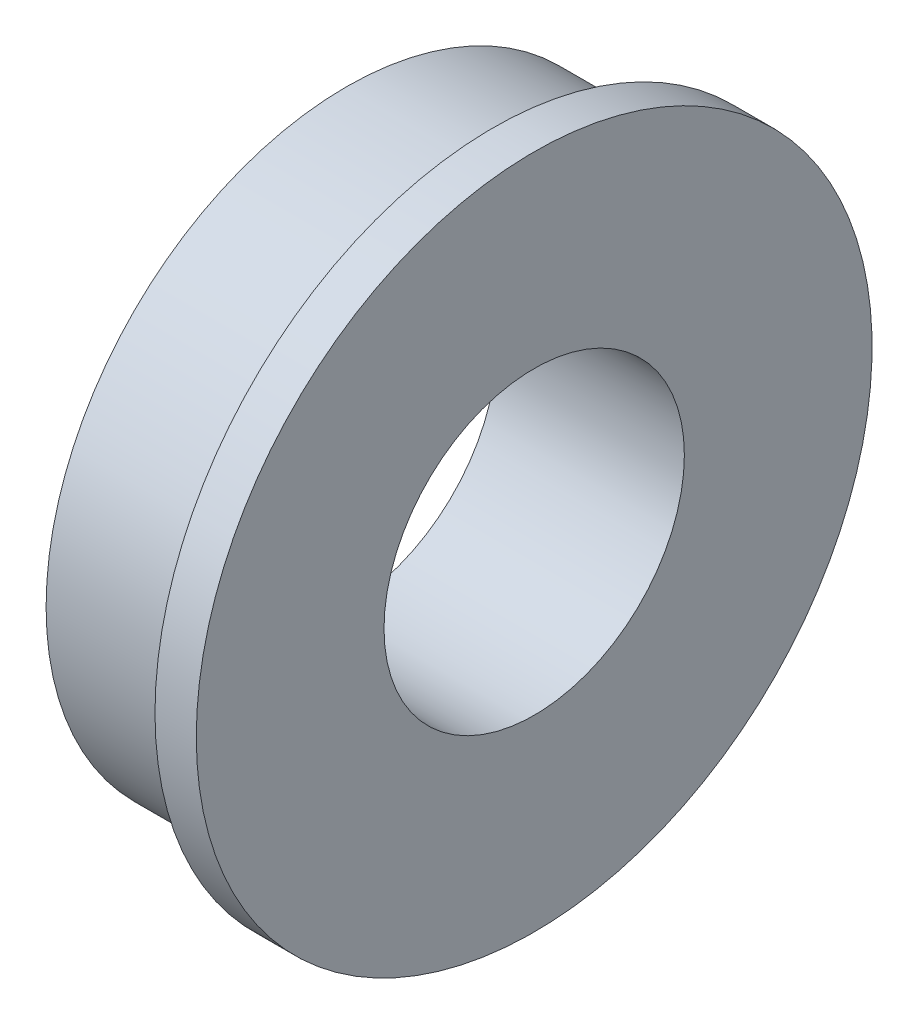
ISO-10303-21;
HEADER;
FILE_DESCRIPTION(('STEP AP214'),'2;1');
FILE_NAME('part.step','',(''),(''),'','','');
FILE_SCHEMA(('AUTOMOTIVE_DESIGN { 1 0 10303 214 1 1 1 1 }'));
ENDSEC;
DATA;
#1=APPLICATION_CONTEXT('core data for automotive mechanical design processes');
#2=APPLICATION_PROTOCOL_DEFINITION('international standard','automotive_design',2000,#1);
#3=PRODUCT_CONTEXT('',#1,'mechanical');
#4=PRODUCT('Part','Part','',(#3));
#5=PRODUCT_RELATED_PRODUCT_CATEGORY('part','',(#4));
#6=PRODUCT_DEFINITION_FORMATION('','',#4);
#7=PRODUCT_DEFINITION_CONTEXT('part definition',#1,'design');
#8=PRODUCT_DEFINITION('design','',#6,#7);
#9=PRODUCT_DEFINITION_SHAPE('','',#8);
#10=(LENGTH_UNIT() NAMED_UNIT(*) SI_UNIT(.MILLI.,.METRE.));
#11=(NAMED_UNIT(*) PLANE_ANGLE_UNIT() SI_UNIT($,.RADIAN.));
#12=(NAMED_UNIT(*) SI_UNIT($,.STERADIAN.) SOLID_ANGLE_UNIT());
#13=UNCERTAINTY_MEASURE_WITH_UNIT(LENGTH_MEASURE(1.E-05),#10,'distance_accuracy_value','');
#14=(GEOMETRIC_REPRESENTATION_CONTEXT(3) GLOBAL_UNCERTAINTY_ASSIGNED_CONTEXT((#13)) GLOBAL_UNIT_ASSIGNED_CONTEXT((#10,
#11,#12)) REPRESENTATION_CONTEXT('',''));
#15=CARTESIAN_POINT('',(0.,0.,0.));
#16=DIRECTION('',(0.,0.,1.));
#17=DIRECTION('',(1.,0.,0.));
#18=AXIS2_PLACEMENT_3D('',#15,#16,#17);
#19=CARTESIAN_POINT('',(-20.6750342490796,0.,0.));
#20=DIRECTION('',(-1.,0.,0.));
#21=DIRECTION('',(0.,0.,1.));
#22=AXIS2_PLACEMENT_3D('',#19,#20,#21);
#23=CYLINDRICAL_SURFACE('',#22,8.);
#24=CARTESIAN_POINT('',(-3.07582880607851,0.,0.));
#25=DIRECTION('',(-1.,0.,0.));
#26=DIRECTION('',(0.,0.,1.));
#27=AXIS2_PLACEMENT_3D('',#24,#25,#26);
#28=CIRCLE('',#27,8.);
#29=CARTESIAN_POINT('',(-3.07582880607851,0.,8.));
#30=VERTEX_POINT('',#29);
#31=EDGE_CURVE('E18',#30,#30,#28,.T.);
#32=ORIENTED_EDGE('',*,*,#31,.T.);
#33=EDGE_LOOP('',(#32));
#34=FACE_BOUND('',#33,.T.);
#35=CARTESIAN_POINT('',(-6.97582880607851,0.,0.));
#36=DIRECTION('',(-1.,0.,0.));
#37=DIRECTION('',(0.,0.,1.));
#38=AXIS2_PLACEMENT_3D('',#35,#36,#37);
#39=CIRCLE('',#38,8.);
#40=CARTESIAN_POINT('',(-6.97582880607851,0.,8.));
#41=VERTEX_POINT('',#40);
#42=EDGE_CURVE('E34',#41,#41,#39,.F.);
#43=ORIENTED_EDGE('',*,*,#42,.T.);
#44=EDGE_LOOP('',(#43));
#45=FACE_BOUND('',#44,.T.);
#46=ADVANCED_FACE('F15',(#34,#45),#23,.T.);
#47=CARTESIAN_POINT('',(-3.07582880607851,8.,0.));
#48=DIRECTION('',(1.,0.,0.));
#49=DIRECTION('',(0.,0.,-1.));
#50=AXIS2_PLACEMENT_3D('',#47,#48,#49);
#51=PLANE('',#50);
#52=ORIENTED_EDGE('',*,*,#31,.F.);
#53=EDGE_LOOP('',(#52));
#54=FACE_BOUND('',#53,.T.);
#55=CARTESIAN_POINT('',(-3.07582880607851,0.,0.));
#56=DIRECTION('',(-1.,0.,0.));
#57=DIRECTION('',(0.,0.,1.));
#58=AXIS2_PLACEMENT_3D('',#55,#56,#57);
#59=CIRCLE('',#58,9.);
#60=CARTESIAN_POINT('',(-3.07582880607851,0.,9.));
#61=VERTEX_POINT('',#60);
#62=EDGE_CURVE('E32',#61,#61,#59,.F.);
#63=ORIENTED_EDGE('',*,*,#62,.F.);
#64=EDGE_LOOP('',(#63));
#65=FACE_BOUND('',#64,.T.);
#66=ADVANCED_FACE('F42',(#54,#65),#51,.F.);
#67=CARTESIAN_POINT('',(-6.97582880607851,4.,0.));
#68=DIRECTION('',(1.,0.,0.));
#69=DIRECTION('',(0.,0.,-1.));
#70=AXIS2_PLACEMENT_3D('',#67,#68,#69);
#71=PLANE('',#70);
#72=CARTESIAN_POINT('',(-6.97582880607851,0.,0.));
#73=DIRECTION('',(-1.,0.,0.));
#74=DIRECTION('',(0.,0.,1.));
#75=AXIS2_PLACEMENT_3D('',#72,#73,#74);
#76=CIRCLE('',#75,4.);
#77=CARTESIAN_POINT('',(-6.97582880607851,0.,4.));
#78=VERTEX_POINT('',#77);
#79=EDGE_CURVE('E27',#78,#78,#76,.F.);
#80=ORIENTED_EDGE('',*,*,#79,.T.);
#81=EDGE_LOOP('',(#80));
#82=FACE_BOUND('',#81,.T.);
#83=ORIENTED_EDGE('',*,*,#42,.F.);
#84=EDGE_LOOP('',(#83));
#85=FACE_BOUND('',#84,.T.);
#86=ADVANCED_FACE('F45',(#82,#85),#71,.F.);
#87=CARTESIAN_POINT('',(-20.6750342490796,0.,0.));
#88=DIRECTION('',(-1.,0.,0.));
#89=DIRECTION('',(0.,0.,1.));
#90=AXIS2_PLACEMENT_3D('',#87,#88,#89);
#91=CYLINDRICAL_SURFACE('',#90,9.);
#92=CARTESIAN_POINT('',(-1.97582880607851,0.,0.));
#93=DIRECTION('',(-1.,0.,0.));
#94=DIRECTION('',(0.,0.,1.));
#95=AXIS2_PLACEMENT_3D('',#92,#93,#94);
#96=CIRCLE('',#95,9.);
#97=CARTESIAN_POINT('',(-1.97582880607851,0.,9.));
#98=VERTEX_POINT('',#97);
#99=EDGE_CURVE('E22',#98,#98,#96,.T.);
#100=ORIENTED_EDGE('',*,*,#99,.T.);
#101=EDGE_LOOP('',(#100));
#102=FACE_BOUND('',#101,.T.);
#103=ORIENTED_EDGE('',*,*,#62,.T.);
#104=EDGE_LOOP('',(#103));
#105=FACE_BOUND('',#104,.T.);
#106=ADVANCED_FACE('F48',(#102,#105),#91,.T.);
#107=CARTESIAN_POINT('',(-20.6750342490796,0.,0.));
#108=DIRECTION('',(-1.,0.,0.));
#109=DIRECTION('',(0.,0.,1.));
#110=AXIS2_PLACEMENT_3D('',#107,#108,#109);
#111=CYLINDRICAL_SURFACE('',#110,4.);
#112=ORIENTED_EDGE('',*,*,#79,.F.);
#113=EDGE_LOOP('',(#112));
#114=FACE_BOUND('',#113,.T.);
#115=CARTESIAN_POINT('',(-1.97582880607851,0.,0.));
#116=DIRECTION('',(-1.,0.,0.));
#117=DIRECTION('',(0.,0.,1.));
#118=AXIS2_PLACEMENT_3D('',#115,#116,#117);
#119=CIRCLE('',#118,4.);
#120=CARTESIAN_POINT('',(-1.97582880607851,0.,4.));
#121=VERTEX_POINT('',#120);
#122=EDGE_CURVE('E10',#121,#121,#119,.F.);
#123=ORIENTED_EDGE('',*,*,#122,.T.);
#124=EDGE_LOOP('',(#123));
#125=FACE_BOUND('',#124,.T.);
#126=ADVANCED_FACE('F50',(#114,#125),#111,.F.);
#127=CARTESIAN_POINT('',(-1.97582880607851,9.,0.));
#128=DIRECTION('',(-1.,0.,0.));
#129=DIRECTION('',(0.,0.,1.));
#130=AXIS2_PLACEMENT_3D('',#127,#128,#129);
#131=PLANE('',#130);
#132=ORIENTED_EDGE('',*,*,#122,.F.);
#133=EDGE_LOOP('',(#132));
#134=FACE_BOUND('',#133,.T.);
#135=ORIENTED_EDGE('',*,*,#99,.F.);
#136=EDGE_LOOP('',(#135));
#137=FACE_BOUND('',#136,.T.);
#138=ADVANCED_FACE('F58',(#134,#137),#131,.F.);
#139=CLOSED_SHELL('',(#46,#66,#86,#106,#126,#138));
#140=MANIFOLD_SOLID_BREP('B1',#139);
#141=ADVANCED_BREP_SHAPE_REPRESENTATION('',(#18,#140),#14);
#142=SHAPE_DEFINITION_REPRESENTATION(#9,#141);
ENDSEC;
END-ISO-10303-21;
